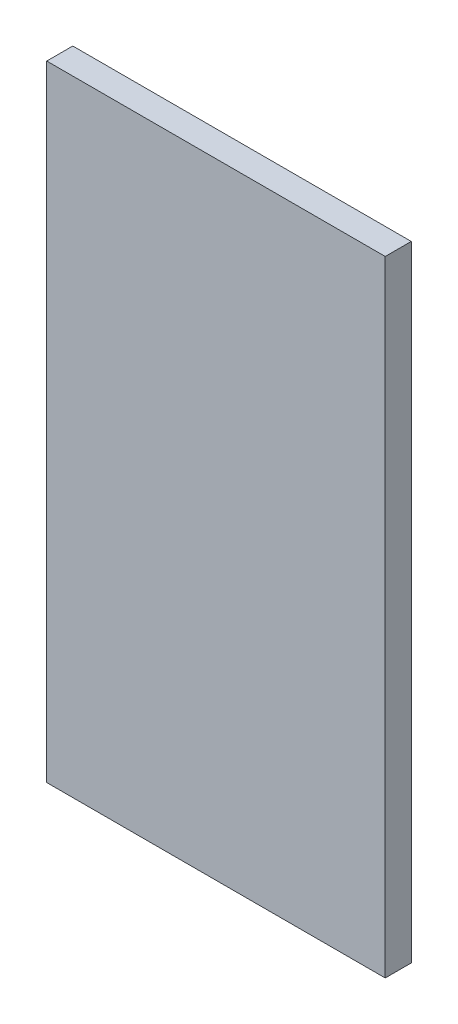
ISO-10303-21;
HEADER;
FILE_DESCRIPTION(('STEP AP214'),'2;1');
FILE_NAME('part.step','',(''),(''),'','','');
FILE_SCHEMA(('AUTOMOTIVE_DESIGN { 1 0 10303 214 1 1 1 1 }'));
ENDSEC;
DATA;
#1=APPLICATION_CONTEXT('core data for automotive mechanical design processes');
#2=APPLICATION_PROTOCOL_DEFINITION('international standard','automotive_design',2000,#1);
#3=PRODUCT_CONTEXT('',#1,'mechanical');
#4=PRODUCT('Part','Part','',(#3));
#5=PRODUCT_RELATED_PRODUCT_CATEGORY('part','',(#4));
#6=PRODUCT_DEFINITION_FORMATION('','',#4);
#7=PRODUCT_DEFINITION_CONTEXT('part definition',#1,'design');
#8=PRODUCT_DEFINITION('design','',#6,#7);
#9=PRODUCT_DEFINITION_SHAPE('','',#8);
#10=(LENGTH_UNIT() NAMED_UNIT(*) SI_UNIT(.MILLI.,.METRE.));
#11=(NAMED_UNIT(*) PLANE_ANGLE_UNIT() SI_UNIT($,.RADIAN.));
#12=(NAMED_UNIT(*) SI_UNIT($,.STERADIAN.) SOLID_ANGLE_UNIT());
#13=UNCERTAINTY_MEASURE_WITH_UNIT(LENGTH_MEASURE(1.E-05),#10,'distance_accuracy_value','');
#14=(GEOMETRIC_REPRESENTATION_CONTEXT(3) GLOBAL_UNCERTAINTY_ASSIGNED_CONTEXT((#13)) GLOBAL_UNIT_ASSIGNED_CONTEXT((#10,
#11,#12)) REPRESENTATION_CONTEXT('',''));
#15=CARTESIAN_POINT('',(0.,0.,0.));
#16=DIRECTION('',(0.,0.,1.));
#17=DIRECTION('',(1.,0.,0.));
#18=AXIS2_PLACEMENT_3D('',#15,#16,#17);
#19=CARTESIAN_POINT('',(-48.368085106383,152.4,-30.6015957446809));
#20=DIRECTION('',(1.,0.,0.));
#21=DIRECTION('',(0.,0.,-1.));
#22=AXIS2_PLACEMENT_3D('',#19,#20,#21);
#23=PLANE('',#22);
#24=DIRECTION('',(0.,0.,1.));
#25=VECTOR('',#24,1.);
#26=CARTESIAN_POINT('',(-48.368085106383,0.,-30.6015957446809));
#27=LINE('',#26,#25);
#28=CARTESIAN_POINT('',(-48.368085106383,0.,-30.6015957446809));
#29=VERTEX_POINT('',#28);
#30=CARTESIAN_POINT('',(-48.368085106383,0.,-24.2515957446809));
#31=VERTEX_POINT('',#30);
#32=EDGE_CURVE('E96',#29,#31,#27,.T.);
#33=ORIENTED_EDGE('',*,*,#32,.T.);
#34=DIRECTION('',(0.,-1.,0.));
#35=VECTOR('',#34,1.);
#36=CARTESIAN_POINT('',(-48.368085106383,152.4,-24.2515957446809));
#37=LINE('',#36,#35);
#38=CARTESIAN_POINT('',(-48.368085106383,152.4,-24.2515957446809));
#39=VERTEX_POINT('',#38);
#40=EDGE_CURVE('E11',#39,#31,#37,.T.);
#41=ORIENTED_EDGE('',*,*,#40,.F.);
#42=DIRECTION('',(0.,0.,1.));
#43=VECTOR('',#42,1.);
#44=CARTESIAN_POINT('',(-48.368085106383,152.4,-30.6015957446809));
#45=LINE('',#44,#43);
#46=CARTESIAN_POINT('',(-48.368085106383,152.4,-30.6015957446809));
#47=VERTEX_POINT('',#46);
#48=EDGE_CURVE('E84',#47,#39,#45,.T.);
#49=ORIENTED_EDGE('',*,*,#48,.F.);
#50=DIRECTION('',(0.,-1.,0.));
#51=VECTOR('',#50,1.);
#52=CARTESIAN_POINT('',(-48.368085106383,152.4,-30.6015957446809));
#53=LINE('',#52,#51);
#54=EDGE_CURVE('E92',#47,#29,#53,.T.);
#55=ORIENTED_EDGE('',*,*,#54,.T.);
#56=EDGE_LOOP('',(#33,#41,#49,#55));
#57=FACE_BOUND('',#56,.T.);
#58=ADVANCED_FACE('F33',(#57),#23,.F.);
#59=CARTESIAN_POINT('',(-48.368085106383,152.4,-24.2515957446809));
#60=DIRECTION('',(0.,0.,-1.));
#61=DIRECTION('',(-1.,0.,0.));
#62=AXIS2_PLACEMENT_3D('',#59,#60,#61);
#63=PLANE('',#62);
#64=DIRECTION('',(1.,0.,0.));
#65=VECTOR('',#64,1.);
#66=CARTESIAN_POINT('',(-48.368085106383,0.,-24.2515957446809));
#67=LINE('',#66,#65);
#68=CARTESIAN_POINT('',(34.181914893617,0.,-24.2515957446809));
#69=VERTEX_POINT('',#68);
#70=EDGE_CURVE('E88',#31,#69,#67,.T.);
#71=ORIENTED_EDGE('',*,*,#70,.T.);
#72=DIRECTION('',(0.,-1.,0.));
#73=VECTOR('',#72,1.);
#74=CARTESIAN_POINT('',(34.181914893617,152.4,-24.2515957446809));
#75=LINE('',#74,#73);
#76=CARTESIAN_POINT('',(34.181914893617,152.4,-24.2515957446809));
#77=VERTEX_POINT('',#76);
#78=EDGE_CURVE('E41',#77,#69,#75,.T.);
#79=ORIENTED_EDGE('',*,*,#78,.F.);
#80=DIRECTION('',(1.,0.,0.));
#81=VECTOR('',#80,1.);
#82=CARTESIAN_POINT('',(-48.368085106383,152.4,-24.2515957446809));
#83=LINE('',#82,#81);
#84=EDGE_CURVE('E79',#39,#77,#83,.T.);
#85=ORIENTED_EDGE('',*,*,#84,.F.);
#86=ORIENTED_EDGE('',*,*,#40,.T.);
#87=EDGE_LOOP('',(#71,#79,#85,#86));
#88=FACE_BOUND('',#87,.T.);
#89=ADVANCED_FACE('F87',(#88),#63,.F.);
#90=CARTESIAN_POINT('',(34.181914893617,152.4,-30.6015957446809));
#91=DIRECTION('',(-1.,0.,0.));
#92=DIRECTION('',(0.,0.,1.));
#93=AXIS2_PLACEMENT_3D('',#90,#91,#92);
#94=PLANE('',#93);
#95=DIRECTION('',(0.,0.,-1.));
#96=VECTOR('',#95,1.);
#97=CARTESIAN_POINT('',(34.181914893617,0.,-30.6015957446809));
#98=LINE('',#97,#96);
#99=CARTESIAN_POINT('',(34.181914893617,0.,-30.6015957446809));
#100=VERTEX_POINT('',#99);
#101=EDGE_CURVE('E66',#69,#100,#98,.T.);
#102=ORIENTED_EDGE('',*,*,#101,.T.);
#103=DIRECTION('',(0.,-1.,0.));
#104=VECTOR('',#103,1.);
#105=CARTESIAN_POINT('',(34.181914893617,152.4,-30.6015957446809));
#106=LINE('',#105,#104);
#107=CARTESIAN_POINT('',(34.181914893617,152.4,-30.6015957446809));
#108=VERTEX_POINT('',#107);
#109=EDGE_CURVE('E89',#108,#100,#106,.T.);
#110=ORIENTED_EDGE('',*,*,#109,.F.);
#111=DIRECTION('',(0.,0.,-1.));
#112=VECTOR('',#111,1.);
#113=CARTESIAN_POINT('',(34.181914893617,152.4,-30.6015957446809));
#114=LINE('',#113,#112);
#115=EDGE_CURVE('E82',#77,#108,#114,.T.);
#116=ORIENTED_EDGE('',*,*,#115,.F.);
#117=ORIENTED_EDGE('',*,*,#78,.T.);
#118=EDGE_LOOP('',(#102,#110,#116,#117));
#119=FACE_BOUND('',#118,.T.);
#120=ADVANCED_FACE('F90',(#119),#94,.F.);
#121=CARTESIAN_POINT('',(-48.368085106383,152.4,-30.6015957446809));
#122=DIRECTION('',(0.,0.,1.));
#123=DIRECTION('',(1.,0.,0.));
#124=AXIS2_PLACEMENT_3D('',#121,#122,#123);
#125=PLANE('',#124);
#126=DIRECTION('',(-1.,0.,0.));
#127=VECTOR('',#126,1.);
#128=CARTESIAN_POINT('',(-48.368085106383,0.,-30.6015957446809));
#129=LINE('',#128,#127);
#130=EDGE_CURVE('E72',#100,#29,#129,.T.);
#131=ORIENTED_EDGE('',*,*,#130,.T.);
#132=ORIENTED_EDGE('',*,*,#54,.F.);
#133=DIRECTION('',(-1.,0.,0.));
#134=VECTOR('',#133,1.);
#135=CARTESIAN_POINT('',(-48.368085106383,152.4,-30.6015957446809));
#136=LINE('',#135,#134);
#137=EDGE_CURVE('E49',#108,#47,#136,.T.);
#138=ORIENTED_EDGE('',*,*,#137,.F.);
#139=ORIENTED_EDGE('',*,*,#109,.T.);
#140=EDGE_LOOP('',(#131,#132,#138,#139));
#141=FACE_BOUND('',#140,.T.);
#142=ADVANCED_FACE('F103',(#141),#125,.F.);
#143=CARTESIAN_POINT('',(0.,152.4,0.));
#144=DIRECTION('',(0.,1.,0.));
#145=DIRECTION('',(0.,0.,1.));
#146=AXIS2_PLACEMENT_3D('',#143,#144,#145);
#147=PLANE('',#146);
#148=ORIENTED_EDGE('',*,*,#48,.T.);
#149=ORIENTED_EDGE('',*,*,#84,.T.);
#150=ORIENTED_EDGE('',*,*,#115,.T.);
#151=ORIENTED_EDGE('',*,*,#137,.T.);
#152=EDGE_LOOP('',(#148,#149,#150,#151));
#153=FACE_BOUND('',#152,.T.);
#154=ADVANCED_FACE('F80',(#153),#147,.T.);
#155=CARTESIAN_POINT('',(0.,0.,0.));
#156=DIRECTION('',(0.,1.,0.));
#157=DIRECTION('',(0.,0.,1.));
#158=AXIS2_PLACEMENT_3D('',#155,#156,#157);
#159=PLANE('',#158);
#160=ORIENTED_EDGE('',*,*,#32,.F.);
#161=ORIENTED_EDGE('',*,*,#130,.F.);
#162=ORIENTED_EDGE('',*,*,#101,.F.);
#163=ORIENTED_EDGE('',*,*,#70,.F.);
#164=EDGE_LOOP('',(#160,#161,#162,#163));
#165=FACE_BOUND('',#164,.T.);
#166=ADVANCED_FACE('F106',(#165),#159,.F.);
#167=CLOSED_SHELL('',(#58,#89,#120,#142,#154,#166));
#168=MANIFOLD_SOLID_BREP('B2',#167);
#169=ADVANCED_BREP_SHAPE_REPRESENTATION('',(#18,#168),#14);
#170=SHAPE_DEFINITION_REPRESENTATION(#9,#169);
ENDSEC;
END-ISO-10303-21;
